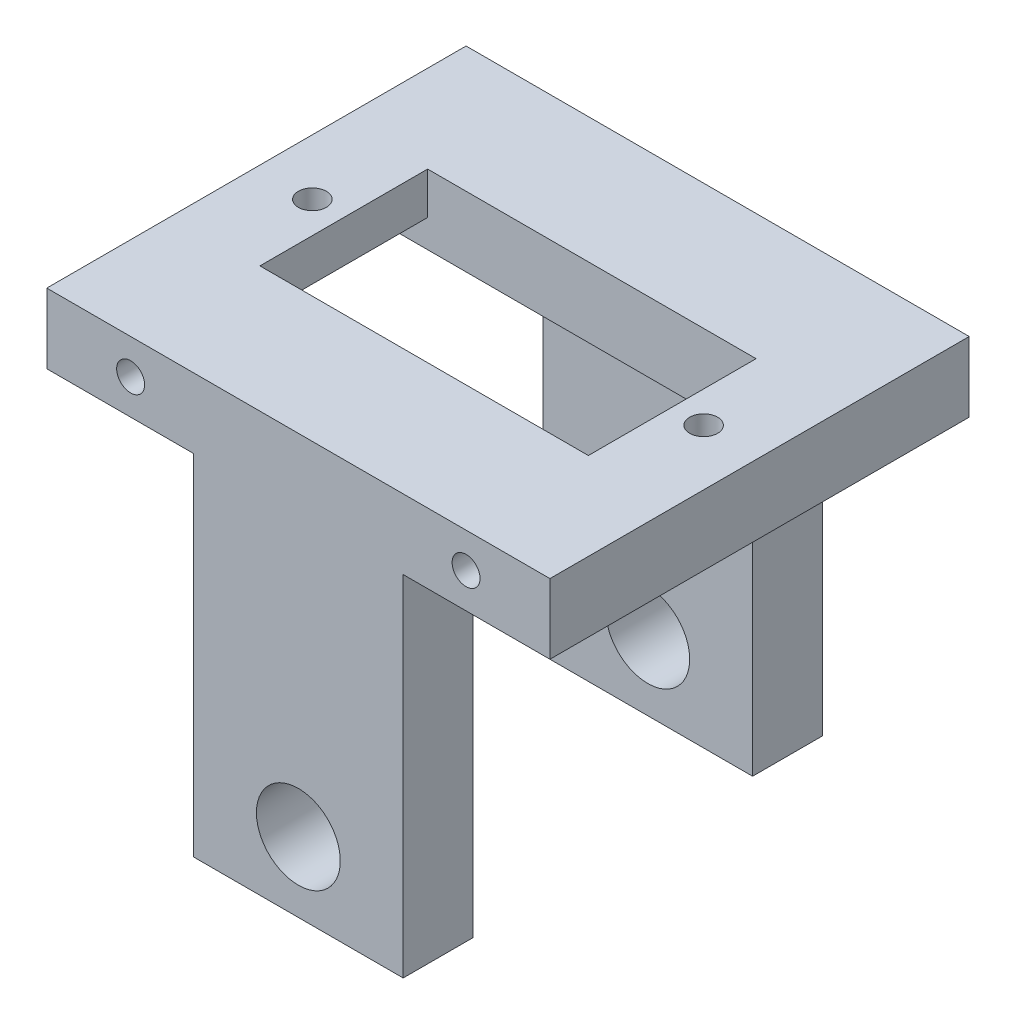
ISO-10303-21;
HEADER;
FILE_DESCRIPTION(('STEP AP214'),'2;1');
FILE_NAME('part.step','',(''),(''),'','','');
FILE_SCHEMA(('AUTOMOTIVE_DESIGN { 1 0 10303 214 1 1 1 1 }'));
ENDSEC;
DATA;
#1=APPLICATION_CONTEXT('core data for automotive mechanical design processes');
#2=APPLICATION_PROTOCOL_DEFINITION('international standard','automotive_design',2000,#1);
#3=PRODUCT_CONTEXT('',#1,'mechanical');
#4=PRODUCT('Part','Part','',(#3));
#5=PRODUCT_RELATED_PRODUCT_CATEGORY('part','',(#4));
#6=PRODUCT_DEFINITION_FORMATION('','',#4);
#7=PRODUCT_DEFINITION_CONTEXT('part definition',#1,'design');
#8=PRODUCT_DEFINITION('design','',#6,#7);
#9=PRODUCT_DEFINITION_SHAPE('','',#8);
#10=(LENGTH_UNIT() NAMED_UNIT(*) SI_UNIT(.MILLI.,.METRE.));
#11=(NAMED_UNIT(*) PLANE_ANGLE_UNIT() SI_UNIT($,.RADIAN.));
#12=(NAMED_UNIT(*) SI_UNIT($,.STERADIAN.) SOLID_ANGLE_UNIT());
#13=UNCERTAINTY_MEASURE_WITH_UNIT(LENGTH_MEASURE(1.E-05),#10,'distance_accuracy_value','');
#14=(GEOMETRIC_REPRESENTATION_CONTEXT(3) GLOBAL_UNCERTAINTY_ASSIGNED_CONTEXT((#13)) GLOBAL_UNIT_ASSIGNED_CONTEXT((#10,
#11,#12)) REPRESENTATION_CONTEXT('',''));
#15=CARTESIAN_POINT('',(0.,0.,0.));
#16=DIRECTION('',(0.,0.,1.));
#17=DIRECTION('',(1.,0.,0.));
#18=AXIS2_PLACEMENT_3D('',#15,#16,#17);
#19=CARTESIAN_POINT('',(0.,0.,0.));
#20=DIRECTION('',(0.,1.,0.));
#21=DIRECTION('',(0.,0.,1.));
#22=AXIS2_PLACEMENT_3D('',#19,#20,#21);
#23=PLANE('',#22);
#24=DIRECTION('',(-1.,0.,0.));
#25=VECTOR('',#24,1.);
#26=CARTESIAN_POINT('',(-16.5,0.,6.));
#27=LINE('',#26,#25);
#28=CARTESIAN_POINT('',(16.5,0.,6.));
#29=VERTEX_POINT('',#28);
#30=CARTESIAN_POINT('',(-16.5,0.,6.));
#31=VERTEX_POINT('',#30);
#32=EDGE_CURVE('E309',#29,#31,#27,.T.);
#33=ORIENTED_EDGE('',*,*,#32,.F.);
#34=DIRECTION('',(0.,0.,1.));
#35=VECTOR('',#34,1.);
#36=CARTESIAN_POINT('',(16.5,0.,6.));
#37=LINE('',#36,#35);
#38=CARTESIAN_POINT('',(16.5,0.,-6.));
#39=VERTEX_POINT('',#38);
#40=EDGE_CURVE('E289',#39,#29,#37,.T.);
#41=ORIENTED_EDGE('',*,*,#40,.F.);
#42=DIRECTION('',(1.,0.,0.));
#43=VECTOR('',#42,1.);
#44=CARTESIAN_POINT('',(-16.5,0.,-6.));
#45=LINE('',#44,#43);
#46=CARTESIAN_POINT('',(-16.5,0.,-6.));
#47=VERTEX_POINT('',#46);
#48=EDGE_CURVE('E296',#47,#39,#45,.T.);
#49=ORIENTED_EDGE('',*,*,#48,.F.);
#50=DIRECTION('',(0.,0.,-1.));
#51=VECTOR('',#50,1.);
#52=CARTESIAN_POINT('',(-16.5,0.,6.));
#53=LINE('',#52,#51);
#54=EDGE_CURVE('E311',#31,#47,#53,.T.);
#55=ORIENTED_EDGE('',*,*,#54,.F.);
#56=EDGE_LOOP('',(#33,#41,#49,#55));
#57=FACE_BOUND('',#56,.T.);
#58=DIRECTION('',(0.,0.,-1.));
#59=VECTOR('',#58,1.);
#60=CARTESIAN_POINT('',(-7.50000000000001,0.,-15.));
#61=LINE('',#60,#59);
#62=CARTESIAN_POINT('',(-7.5,0.,-9.99999999999998));
#63=VERTEX_POINT('',#62);
#64=CARTESIAN_POINT('',(-7.50000000000001,0.,-15.));
#65=VERTEX_POINT('',#64);
#66=EDGE_CURVE('E55',#63,#65,#61,.T.);
#67=ORIENTED_EDGE('',*,*,#66,.F.);
#68=DIRECTION('',(-1.,0.,0.));
#69=VECTOR('',#68,1.);
#70=CARTESIAN_POINT('',(-7.5,0.,-9.99999999999998));
#71=LINE('',#70,#69);
#72=CARTESIAN_POINT('',(7.5,0.,-9.99999999999999));
#73=VERTEX_POINT('',#72);
#74=EDGE_CURVE('E179',#73,#63,#71,.T.);
#75=ORIENTED_EDGE('',*,*,#74,.F.);
#76=DIRECTION('',(0.,0.,1.));
#77=VECTOR('',#76,1.);
#78=CARTESIAN_POINT('',(7.49999999999999,0.,-15.));
#79=LINE('',#78,#77);
#80=CARTESIAN_POINT('',(7.49999999999999,0.,-15.));
#81=VERTEX_POINT('',#80);
#82=EDGE_CURVE('E187',#81,#73,#79,.T.);
#83=ORIENTED_EDGE('',*,*,#82,.F.);
#84=DIRECTION('',(-1.,0.,0.));
#85=VECTOR('',#84,1.);
#86=CARTESIAN_POINT('',(-18.,0.,-15.));
#87=LINE('',#86,#85);
#88=CARTESIAN_POINT('',(18.,0.,-15.));
#89=VERTEX_POINT('',#88);
#90=EDGE_CURVE('E339',#89,#81,#87,.T.);
#91=ORIENTED_EDGE('',*,*,#90,.F.);
#92=DIRECTION('',(0.,0.,-1.));
#93=VECTOR('',#92,1.);
#94=CARTESIAN_POINT('',(18.,0.,-15.));
#95=LINE('',#94,#93);
#96=CARTESIAN_POINT('',(18.,0.,15.));
#97=VERTEX_POINT('',#96);
#98=EDGE_CURVE('E318',#97,#89,#95,.T.);
#99=ORIENTED_EDGE('',*,*,#98,.F.);
#100=DIRECTION('',(1.,0.,0.));
#101=VECTOR('',#100,1.);
#102=CARTESIAN_POINT('',(-18.,0.,15.));
#103=LINE('',#102,#101);
#104=CARTESIAN_POINT('',(7.50000000000001,0.,15.));
#105=VERTEX_POINT('',#104);
#106=EDGE_CURVE('E344',#105,#97,#103,.T.);
#107=ORIENTED_EDGE('',*,*,#106,.F.);
#108=DIRECTION('',(0.,0.,1.));
#109=VECTOR('',#108,1.);
#110=CARTESIAN_POINT('',(7.50000000000001,0.,15.));
#111=LINE('',#110,#109);
#112=CARTESIAN_POINT('',(7.50000000000001,0.,9.99999999999999));
#113=VERTEX_POINT('',#112);
#114=EDGE_CURVE('E63',#113,#105,#111,.T.);
#115=ORIENTED_EDGE('',*,*,#114,.F.);
#116=DIRECTION('',(1.,0.,0.));
#117=VECTOR('',#116,1.);
#118=CARTESIAN_POINT('',(-7.49999999999999,0.,9.99999999999999));
#119=LINE('',#118,#117);
#120=CARTESIAN_POINT('',(-7.49999999999999,0.,9.99999999999999));
#121=VERTEX_POINT('',#120);
#122=EDGE_CURVE('E212',#121,#113,#119,.T.);
#123=ORIENTED_EDGE('',*,*,#122,.F.);
#124=DIRECTION('',(0.,0.,-1.));
#125=VECTOR('',#124,1.);
#126=CARTESIAN_POINT('',(-7.49999999999999,0.,15.));
#127=LINE('',#126,#125);
#128=CARTESIAN_POINT('',(-7.49999999999999,0.,15.));
#129=VERTEX_POINT('',#128);
#130=EDGE_CURVE('E198',#129,#121,#127,.T.);
#131=ORIENTED_EDGE('',*,*,#130,.F.);
#132=CARTESIAN_POINT('',(-18.,0.,15.));
#133=VERTEX_POINT('',#132);
#134=EDGE_CURVE('E330',#133,#129,#103,.T.);
#135=ORIENTED_EDGE('',*,*,#134,.F.);
#136=DIRECTION('',(0.,0.,1.));
#137=VECTOR('',#136,1.);
#138=CARTESIAN_POINT('',(-18.,0.,-15.));
#139=LINE('',#138,#137);
#140=CARTESIAN_POINT('',(-18.,0.,-15.));
#141=VERTEX_POINT('',#140);
#142=EDGE_CURVE('E342',#141,#133,#139,.T.);
#143=ORIENTED_EDGE('',*,*,#142,.F.);
#144=EDGE_CURVE('E196',#65,#141,#87,.T.);
#145=ORIENTED_EDGE('',*,*,#144,.F.);
#146=EDGE_LOOP('',(#67,#75,#83,#91,#99,#107,#115,#123,#131,#135,#143,#145));
#147=FACE_BOUND('',#146,.T.);
#148=ADVANCED_FACE('F39',(#57,#147),#23,.F.);
#149=CARTESIAN_POINT('',(0.,2.,0.));
#150=DIRECTION('',(0.,-1.,0.));
#151=DIRECTION('',(0.,0.,-1.));
#152=AXIS2_PLACEMENT_3D('',#149,#150,#151);
#153=PLANE('',#152);
#154=DIRECTION('',(0.,0.,-1.));
#155=VECTOR('',#154,1.);
#156=CARTESIAN_POINT('',(-11.75,2.,0.));
#157=LINE('',#156,#155);
#158=CARTESIAN_POINT('',(-11.75,2.,6.));
#159=VERTEX_POINT('',#158);
#160=CARTESIAN_POINT('',(-11.75,2.,-6.));
#161=VERTEX_POINT('',#160);
#162=EDGE_CURVE('E11',#159,#161,#157,.T.);
#163=ORIENTED_EDGE('',*,*,#162,.F.);
#164=DIRECTION('',(-1.,0.,0.));
#165=VECTOR('',#164,1.);
#166=CARTESIAN_POINT('',(-16.5,2.,6.));
#167=LINE('',#166,#165);
#168=CARTESIAN_POINT('',(-16.5,2.,6.));
#169=VERTEX_POINT('',#168);
#170=EDGE_CURVE('E295',#159,#169,#167,.T.);
#171=ORIENTED_EDGE('',*,*,#170,.T.);
#172=DIRECTION('',(0.,0.,-1.));
#173=VECTOR('',#172,1.);
#174=CARTESIAN_POINT('',(-16.5,2.,6.));
#175=LINE('',#174,#173);
#176=CARTESIAN_POINT('',(-16.5,2.,-6.));
#177=VERTEX_POINT('',#176);
#178=EDGE_CURVE('E300',#169,#177,#175,.T.);
#179=ORIENTED_EDGE('',*,*,#178,.T.);
#180=DIRECTION('',(1.,0.,0.));
#181=VECTOR('',#180,1.);
#182=CARTESIAN_POINT('',(-16.5,2.,-6.));
#183=LINE('',#182,#181);
#184=EDGE_CURVE('E304',#177,#161,#183,.T.);
#185=ORIENTED_EDGE('',*,*,#184,.T.);
#186=EDGE_LOOP('',(#163,#171,#179,#185));
#187=FACE_BOUND('',#186,.T.);
#188=CARTESIAN_POINT('',(-14.,2.,0.));
#189=DIRECTION('',(0.,-1.,0.));
#190=DIRECTION('',(0.,0.,-1.));
#191=AXIS2_PLACEMENT_3D('',#188,#189,#190);
#192=CIRCLE('',#191,1.);
#193=CARTESIAN_POINT('',(-14.,2.,-1.));
#194=VERTEX_POINT('',#193);
#195=EDGE_CURVE('E279',#194,#194,#192,.T.);
#196=ORIENTED_EDGE('',*,*,#195,.F.);
#197=EDGE_LOOP('',(#196));
#198=FACE_BOUND('',#197,.T.);
#199=ADVANCED_FACE('F387',(#187,#198),#153,.T.);
#200=CARTESIAN_POINT('',(18.,5.,-15.));
#201=DIRECTION('',(-1.,0.,0.));
#202=DIRECTION('',(0.,0.,1.));
#203=AXIS2_PLACEMENT_3D('',#200,#201,#202);
#204=PLANE('',#203);
#205=ORIENTED_EDGE('',*,*,#98,.T.);
#206=DIRECTION('',(0.,-1.,0.));
#207=VECTOR('',#206,1.);
#208=CARTESIAN_POINT('',(18.,5.,-15.));
#209=LINE('',#208,#207);
#210=CARTESIAN_POINT('',(18.,5.,-15.));
#211=VERTEX_POINT('',#210);
#212=EDGE_CURVE('E355',#211,#89,#209,.T.);
#213=ORIENTED_EDGE('',*,*,#212,.F.);
#214=DIRECTION('',(0.,0.,-1.));
#215=VECTOR('',#214,1.);
#216=CARTESIAN_POINT('',(18.,5.,-15.));
#217=LINE('',#216,#215);
#218=CARTESIAN_POINT('',(18.,5.,15.));
#219=VERTEX_POINT('',#218);
#220=EDGE_CURVE('E326',#219,#211,#217,.T.);
#221=ORIENTED_EDGE('',*,*,#220,.F.);
#222=DIRECTION('',(0.,-1.,0.));
#223=VECTOR('',#222,1.);
#224=CARTESIAN_POINT('',(18.,5.,15.));
#225=LINE('',#224,#223);
#226=EDGE_CURVE('E336',#219,#97,#225,.T.);
#227=ORIENTED_EDGE('',*,*,#226,.T.);
#228=EDGE_LOOP('',(#205,#213,#221,#227));
#229=FACE_BOUND('',#228,.T.);
#230=ADVANCED_FACE('F41',(#229),#204,.F.);
#231=CARTESIAN_POINT('',(-18.,5.,-15.));
#232=DIRECTION('',(0.,0.,1.));
#233=DIRECTION('',(1.,0.,0.));
#234=AXIS2_PLACEMENT_3D('',#231,#232,#233);
#235=PLANE('',#234);
#236=CARTESIAN_POINT('',(0.,-20.,-15.));
#237=DIRECTION('',(0.,0.,-1.));
#238=DIRECTION('',(-1.,0.,0.));
#239=AXIS2_PLACEMENT_3D('',#236,#237,#238);
#240=CIRCLE('',#239,3.);
#241=CARTESIAN_POINT('',(-3.,-20.,-15.));
#242=VERTEX_POINT('',#241);
#243=EDGE_CURVE('E436',#242,#242,#240,.T.);
#244=ORIENTED_EDGE('',*,*,#243,.F.);
#245=EDGE_LOOP('',(#244));
#246=FACE_BOUND('',#245,.T.);
#247=CARTESIAN_POINT('',(12.,2.5,-15.));
#248=DIRECTION('',(0.,0.,-1.));
#249=DIRECTION('',(1.,0.,0.));
#250=AXIS2_PLACEMENT_3D('',#247,#248,#249);
#251=CIRCLE('',#250,1.);
#252=CARTESIAN_POINT('',(13.,2.5,-15.));
#253=VERTEX_POINT('',#252);
#254=EDGE_CURVE('E243',#253,#253,#251,.T.);
#255=ORIENTED_EDGE('',*,*,#254,.F.);
#256=EDGE_LOOP('',(#255));
#257=FACE_BOUND('',#256,.T.);
#258=CARTESIAN_POINT('',(-12.,2.5,-15.));
#259=DIRECTION('',(0.,0.,-1.));
#260=DIRECTION('',(-1.,0.,0.));
#261=AXIS2_PLACEMENT_3D('',#258,#259,#260);
#262=CIRCLE('',#261,1.);
#263=CARTESIAN_POINT('',(-13.,2.5,-15.));
#264=VERTEX_POINT('',#263);
#265=EDGE_CURVE('E249',#264,#264,#262,.T.);
#266=ORIENTED_EDGE('',*,*,#265,.F.);
#267=EDGE_LOOP('',(#266));
#268=FACE_BOUND('',#267,.T.);
#269=ORIENTED_EDGE('',*,*,#90,.T.);
#270=DIRECTION('',(0.,1.,0.));
#271=VECTOR('',#270,1.);
#272=CARTESIAN_POINT('',(7.49999999999999,-25.,-15.));
#273=LINE('',#272,#271);
#274=CARTESIAN_POINT('',(7.49999999999999,-25.,-15.));
#275=VERTEX_POINT('',#274);
#276=EDGE_CURVE('E424',#275,#81,#273,.T.);
#277=ORIENTED_EDGE('',*,*,#276,.F.);
#278=DIRECTION('',(1.,0.,0.));
#279=VECTOR('',#278,1.);
#280=CARTESIAN_POINT('',(-7.50000000000001,-25.,-15.));
#281=LINE('',#280,#279);
#282=CARTESIAN_POINT('',(-7.50000000000001,-25.,-15.));
#283=VERTEX_POINT('',#282);
#284=EDGE_CURVE('E205',#283,#275,#281,.T.);
#285=ORIENTED_EDGE('',*,*,#284,.F.);
#286=DIRECTION('',(0.,1.,0.));
#287=VECTOR('',#286,1.);
#288=CARTESIAN_POINT('',(-7.50000000000001,-25.,-15.));
#289=LINE('',#288,#287);
#290=EDGE_CURVE('E425',#283,#65,#289,.T.);
#291=ORIENTED_EDGE('',*,*,#290,.T.);
#292=ORIENTED_EDGE('',*,*,#144,.T.);
#293=DIRECTION('',(0.,-1.,0.));
#294=VECTOR('',#293,1.);
#295=CARTESIAN_POINT('',(-18.,5.,-15.));
#296=LINE('',#295,#294);
#297=CARTESIAN_POINT('',(-18.,5.,-15.));
#298=VERTEX_POINT('',#297);
#299=EDGE_CURVE('E352',#298,#141,#296,.T.);
#300=ORIENTED_EDGE('',*,*,#299,.F.);
#301=DIRECTION('',(-1.,0.,0.));
#302=VECTOR('',#301,1.);
#303=CARTESIAN_POINT('',(-18.,5.,-15.));
#304=LINE('',#303,#302);
#305=EDGE_CURVE('E329',#211,#298,#304,.T.);
#306=ORIENTED_EDGE('',*,*,#305,.F.);
#307=ORIENTED_EDGE('',*,*,#212,.T.);
#308=EDGE_LOOP('',(#269,#277,#285,#291,#292,#300,#306,#307));
#309=FACE_BOUND('',#308,.T.);
#310=ADVANCED_FACE('F413',(#246,#257,#268,#309),#235,.F.);
#311=CARTESIAN_POINT('',(-18.,5.,-15.));
#312=DIRECTION('',(1.,0.,0.));
#313=DIRECTION('',(0.,0.,-1.));
#314=AXIS2_PLACEMENT_3D('',#311,#312,#313);
#315=PLANE('',#314);
#316=ORIENTED_EDGE('',*,*,#142,.T.);
#317=DIRECTION('',(0.,-1.,0.));
#318=VECTOR('',#317,1.);
#319=CARTESIAN_POINT('',(-18.,5.,15.));
#320=LINE('',#319,#318);
#321=CARTESIAN_POINT('',(-18.,5.,15.));
#322=VERTEX_POINT('',#321);
#323=EDGE_CURVE('E349',#322,#133,#320,.T.);
#324=ORIENTED_EDGE('',*,*,#323,.F.);
#325=DIRECTION('',(0.,0.,1.));
#326=VECTOR('',#325,1.);
#327=CARTESIAN_POINT('',(-18.,5.,-15.));
#328=LINE('',#327,#326);
#329=EDGE_CURVE('E332',#298,#322,#328,.T.);
#330=ORIENTED_EDGE('',*,*,#329,.F.);
#331=ORIENTED_EDGE('',*,*,#299,.T.);
#332=EDGE_LOOP('',(#316,#324,#330,#331));
#333=FACE_BOUND('',#332,.T.);
#334=ADVANCED_FACE('F418',(#333),#315,.F.);
#335=CARTESIAN_POINT('',(-18.,5.,15.));
#336=DIRECTION('',(0.,0.,-1.));
#337=DIRECTION('',(-1.,0.,0.));
#338=AXIS2_PLACEMENT_3D('',#335,#336,#337);
#339=PLANE('',#338);
#340=CARTESIAN_POINT('',(0.,-20.,15.));
#341=DIRECTION('',(0.,0.,-1.));
#342=DIRECTION('',(-1.,0.,0.));
#343=AXIS2_PLACEMENT_3D('',#340,#341,#342);
#344=CIRCLE('',#343,3.);
#345=CARTESIAN_POINT('',(-3.,-20.,15.));
#346=VERTEX_POINT('',#345);
#347=EDGE_CURVE('E433',#346,#346,#344,.F.);
#348=ORIENTED_EDGE('',*,*,#347,.F.);
#349=EDGE_LOOP('',(#348));
#350=FACE_BOUND('',#349,.T.);
#351=CARTESIAN_POINT('',(12.,2.5,15.));
#352=DIRECTION('',(0.,0.,-1.));
#353=DIRECTION('',(1.,0.,0.));
#354=AXIS2_PLACEMENT_3D('',#351,#352,#353);
#355=CIRCLE('',#354,1.);
#356=CARTESIAN_POINT('',(13.,2.5,15.));
#357=VERTEX_POINT('',#356);
#358=EDGE_CURVE('E233',#357,#357,#355,.T.);
#359=ORIENTED_EDGE('',*,*,#358,.T.);
#360=EDGE_LOOP('',(#359));
#361=FACE_BOUND('',#360,.T.);
#362=CARTESIAN_POINT('',(-12.,2.5,15.));
#363=DIRECTION('',(0.,0.,-1.));
#364=DIRECTION('',(-1.,0.,0.));
#365=AXIS2_PLACEMENT_3D('',#362,#363,#364);
#366=CIRCLE('',#365,1.);
#367=CARTESIAN_POINT('',(-13.,2.5,15.));
#368=VERTEX_POINT('',#367);
#369=EDGE_CURVE('E237',#368,#368,#366,.T.);
#370=ORIENTED_EDGE('',*,*,#369,.T.);
#371=EDGE_LOOP('',(#370));
#372=FACE_BOUND('',#371,.T.);
#373=ORIENTED_EDGE('',*,*,#134,.T.);
#374=DIRECTION('',(0.,1.,0.));
#375=VECTOR('',#374,1.);
#376=CARTESIAN_POINT('',(-7.49999999999999,-25.,15.));
#377=LINE('',#376,#375);
#378=CARTESIAN_POINT('',(-7.49999999999999,-25.,15.));
#379=VERTEX_POINT('',#378);
#380=EDGE_CURVE('E227',#379,#129,#377,.T.);
#381=ORIENTED_EDGE('',*,*,#380,.F.);
#382=DIRECTION('',(-1.,0.,0.));
#383=VECTOR('',#382,1.);
#384=CARTESIAN_POINT('',(-7.49999999999999,-25.,15.));
#385=LINE('',#384,#383);
#386=CARTESIAN_POINT('',(7.50000000000001,-25.,15.));
#387=VERTEX_POINT('',#386);
#388=EDGE_CURVE('E211',#387,#379,#385,.T.);
#389=ORIENTED_EDGE('',*,*,#388,.F.);
#390=DIRECTION('',(0.,1.,0.));
#391=VECTOR('',#390,1.);
#392=CARTESIAN_POINT('',(7.50000000000001,-25.,15.));
#393=LINE('',#392,#391);
#394=EDGE_CURVE('E230',#387,#105,#393,.T.);
#395=ORIENTED_EDGE('',*,*,#394,.T.);
#396=ORIENTED_EDGE('',*,*,#106,.T.);
#397=ORIENTED_EDGE('',*,*,#226,.F.);
#398=DIRECTION('',(1.,0.,0.));
#399=VECTOR('',#398,1.);
#400=CARTESIAN_POINT('',(-18.,5.,15.));
#401=LINE('',#400,#399);
#402=EDGE_CURVE('E334',#322,#219,#401,.T.);
#403=ORIENTED_EDGE('',*,*,#402,.F.);
#404=ORIENTED_EDGE('',*,*,#323,.T.);
#405=EDGE_LOOP('',(#373,#381,#389,#395,#396,#397,#403,#404));
#406=FACE_BOUND('',#405,.T.);
#407=ADVANCED_FACE('F399',(#350,#361,#372,#406),#339,.F.);
#408=CARTESIAN_POINT('',(0.,5.,0.));
#409=DIRECTION('',(0.,1.,0.));
#410=DIRECTION('',(0.,0.,1.));
#411=AXIS2_PLACEMENT_3D('',#408,#409,#410);
#412=PLANE('',#411);
#413=DIRECTION('',(-1.,0.,0.));
#414=VECTOR('',#413,1.);
#415=CARTESIAN_POINT('',(-11.75,5.,6.));
#416=LINE('',#415,#414);
#417=CARTESIAN_POINT('',(11.75,5.,6.));
#418=VERTEX_POINT('',#417);
#419=CARTESIAN_POINT('',(-11.75,5.,6.));
#420=VERTEX_POINT('',#419);
#421=EDGE_CURVE('E255',#418,#420,#416,.T.);
#422=ORIENTED_EDGE('',*,*,#421,.T.);
#423=DIRECTION('',(0.,0.,-1.));
#424=VECTOR('',#423,1.);
#425=CARTESIAN_POINT('',(-11.75,5.,-6.));
#426=LINE('',#425,#424);
#427=CARTESIAN_POINT('',(-11.75,5.,-6.));
#428=VERTEX_POINT('',#427);
#429=EDGE_CURVE('E270',#420,#428,#426,.T.);
#430=ORIENTED_EDGE('',*,*,#429,.T.);
#431=DIRECTION('',(1.,0.,0.));
#432=VECTOR('',#431,1.);
#433=CARTESIAN_POINT('',(-11.75,5.,-6.));
#434=LINE('',#433,#432);
#435=CARTESIAN_POINT('',(11.75,5.,-6.));
#436=VERTEX_POINT('',#435);
#437=EDGE_CURVE('E266',#428,#436,#434,.T.);
#438=ORIENTED_EDGE('',*,*,#437,.T.);
#439=DIRECTION('',(0.,0.,1.));
#440=VECTOR('',#439,1.);
#441=CARTESIAN_POINT('',(11.75,5.,-6.));
#442=LINE('',#441,#440);
#443=EDGE_CURVE('E261',#436,#418,#442,.T.);
#444=ORIENTED_EDGE('',*,*,#443,.T.);
#445=EDGE_LOOP('',(#422,#430,#438,#444));
#446=FACE_BOUND('',#445,.T.);
#447=CARTESIAN_POINT('',(-14.,5.,0.));
#448=DIRECTION('',(0.,-1.,0.));
#449=DIRECTION('',(0.,0.,-1.));
#450=AXIS2_PLACEMENT_3D('',#447,#448,#449);
#451=CIRCLE('',#450,1.);
#452=CARTESIAN_POINT('',(-14.,5.,-1.));
#453=VERTEX_POINT('',#452);
#454=EDGE_CURVE('E280',#453,#453,#451,.T.);
#455=ORIENTED_EDGE('',*,*,#454,.T.);
#456=EDGE_LOOP('',(#455));
#457=FACE_BOUND('',#456,.T.);
#458=CARTESIAN_POINT('',(14.,5.,0.));
#459=DIRECTION('',(0.,-1.,0.));
#460=DIRECTION('',(0.,0.,-1.));
#461=AXIS2_PLACEMENT_3D('',#458,#459,#460);
#462=CIRCLE('',#461,1.);
#463=CARTESIAN_POINT('',(14.,5.,-1.));
#464=VERTEX_POINT('',#463);
#465=EDGE_CURVE('E286',#464,#464,#462,.T.);
#466=ORIENTED_EDGE('',*,*,#465,.T.);
#467=EDGE_LOOP('',(#466));
#468=FACE_BOUND('',#467,.T.);
#469=ORIENTED_EDGE('',*,*,#220,.T.);
#470=ORIENTED_EDGE('',*,*,#305,.T.);
#471=ORIENTED_EDGE('',*,*,#329,.T.);
#472=ORIENTED_EDGE('',*,*,#402,.T.);
#473=EDGE_LOOP('',(#469,#470,#471,#472));
#474=FACE_BOUND('',#473,.T.);
#475=ADVANCED_FACE('F396',(#446,#457,#468,#474),#412,.T.);
#476=CARTESIAN_POINT('',(16.5,2.,6.));
#477=DIRECTION('',(1.,0.,0.));
#478=DIRECTION('',(0.,0.,-1.));
#479=AXIS2_PLACEMENT_3D('',#476,#477,#478);
#480=PLANE('',#479);
#481=ORIENTED_EDGE('',*,*,#40,.T.);
#482=DIRECTION('',(0.,-1.,0.));
#483=VECTOR('',#482,1.);
#484=CARTESIAN_POINT('',(16.5,2.,6.));
#485=LINE('',#484,#483);
#486=CARTESIAN_POINT('',(16.5,2.,6.));
#487=VERTEX_POINT('',#486);
#488=EDGE_CURVE('E307',#487,#29,#485,.T.);
#489=ORIENTED_EDGE('',*,*,#488,.F.);
#490=DIRECTION('',(0.,0.,1.));
#491=VECTOR('',#490,1.);
#492=CARTESIAN_POINT('',(16.5,2.,6.));
#493=LINE('',#492,#491);
#494=CARTESIAN_POINT('',(16.5,2.,-6.));
#495=VERTEX_POINT('',#494);
#496=EDGE_CURVE('E292',#495,#487,#493,.T.);
#497=ORIENTED_EDGE('',*,*,#496,.F.);
#498=DIRECTION('',(0.,-1.,0.));
#499=VECTOR('',#498,1.);
#500=CARTESIAN_POINT('',(16.5,2.,-6.));
#501=LINE('',#500,#499);
#502=EDGE_CURVE('E315',#495,#39,#501,.T.);
#503=ORIENTED_EDGE('',*,*,#502,.T.);
#504=EDGE_LOOP('',(#481,#489,#497,#503));
#505=FACE_BOUND('',#504,.T.);
#506=ADVANCED_FACE('F374',(#505),#480,.F.);
#507=CARTESIAN_POINT('',(-16.5,2.,-6.));
#508=DIRECTION('',(0.,0.,-1.));
#509=DIRECTION('',(-1.,0.,0.));
#510=AXIS2_PLACEMENT_3D('',#507,#508,#509);
#511=PLANE('',#510);
#512=CARTESIAN_POINT('',(11.75,2.,-6.));
#513=VERTEX_POINT('',#512);
#514=EDGE_CURVE('E303',#513,#495,#183,.T.);
#515=ORIENTED_EDGE('',*,*,#514,.F.);
#516=DIRECTION('',(0.,-1.,0.));
#517=VECTOR('',#516,1.);
#518=CARTESIAN_POINT('',(11.75,31.3865496039175,-6.));
#519=LINE('',#518,#517);
#520=EDGE_CURVE('E265',#436,#513,#519,.T.);
#521=ORIENTED_EDGE('',*,*,#520,.F.);
#522=ORIENTED_EDGE('',*,*,#437,.F.);
#523=DIRECTION('',(0.,-1.,0.));
#524=VECTOR('',#523,1.);
#525=CARTESIAN_POINT('',(-11.75,31.3865496039175,-6.));
#526=LINE('',#525,#524);
#527=EDGE_CURVE('E269',#428,#161,#526,.T.);
#528=ORIENTED_EDGE('',*,*,#527,.T.);
#529=ORIENTED_EDGE('',*,*,#184,.F.);
#530=DIRECTION('',(0.,-1.,0.));
#531=VECTOR('',#530,1.);
#532=CARTESIAN_POINT('',(-16.5,2.,-6.));
#533=LINE('',#532,#531);
#534=EDGE_CURVE('E319',#177,#47,#533,.T.);
#535=ORIENTED_EDGE('',*,*,#534,.T.);
#536=ORIENTED_EDGE('',*,*,#48,.T.);
#537=ORIENTED_EDGE('',*,*,#502,.F.);
#538=EDGE_LOOP('',(#515,#521,#522,#528,#529,#535,#536,#537));
#539=FACE_BOUND('',#538,.T.);
#540=ADVANCED_FACE('F394',(#539),#511,.F.);
#541=CARTESIAN_POINT('',(-16.5,2.,6.));
#542=DIRECTION('',(-1.,0.,0.));
#543=DIRECTION('',(0.,0.,1.));
#544=AXIS2_PLACEMENT_3D('',#541,#542,#543);
#545=PLANE('',#544);
#546=ORIENTED_EDGE('',*,*,#54,.T.);
#547=ORIENTED_EDGE('',*,*,#534,.F.);
#548=ORIENTED_EDGE('',*,*,#178,.F.);
#549=DIRECTION('',(0.,-1.,0.));
#550=VECTOR('',#549,1.);
#551=CARTESIAN_POINT('',(-16.5,2.,6.));
#552=LINE('',#551,#550);
#553=EDGE_CURVE('E321',#169,#31,#552,.T.);
#554=ORIENTED_EDGE('',*,*,#553,.T.);
#555=EDGE_LOOP('',(#546,#547,#548,#554));
#556=FACE_BOUND('',#555,.T.);
#557=ADVANCED_FACE('F382',(#556),#545,.F.);
#558=CARTESIAN_POINT('',(-16.5,2.,6.));
#559=DIRECTION('',(0.,0.,1.));
#560=DIRECTION('',(1.,0.,0.));
#561=AXIS2_PLACEMENT_3D('',#558,#559,#560);
#562=PLANE('',#561);
#563=ORIENTED_EDGE('',*,*,#32,.T.);
#564=ORIENTED_EDGE('',*,*,#553,.F.);
#565=ORIENTED_EDGE('',*,*,#170,.F.);
#566=DIRECTION('',(0.,-1.,0.));
#567=VECTOR('',#566,1.);
#568=CARTESIAN_POINT('',(-11.75,31.3865496039175,6.));
#569=LINE('',#568,#567);
#570=EDGE_CURVE('E260',#420,#159,#569,.T.);
#571=ORIENTED_EDGE('',*,*,#570,.F.);
#572=ORIENTED_EDGE('',*,*,#421,.F.);
#573=DIRECTION('',(0.,-1.,0.));
#574=VECTOR('',#573,1.);
#575=CARTESIAN_POINT('',(11.75,31.3865496039175,6.));
#576=LINE('',#575,#574);
#577=CARTESIAN_POINT('',(11.75,2.,6.));
#578=VERTEX_POINT('',#577);
#579=EDGE_CURVE('E264',#418,#578,#576,.T.);
#580=ORIENTED_EDGE('',*,*,#579,.T.);
#581=EDGE_CURVE('E297',#487,#578,#167,.T.);
#582=ORIENTED_EDGE('',*,*,#581,.F.);
#583=ORIENTED_EDGE('',*,*,#488,.T.);
#584=EDGE_LOOP('',(#563,#564,#565,#571,#572,#580,#582,#583));
#585=FACE_BOUND('',#584,.T.);
#586=ADVANCED_FACE('F367',(#585),#562,.F.);
#587=DIRECTION('',(0.,0.,1.));
#588=VECTOR('',#587,1.);
#589=CARTESIAN_POINT('',(11.75,2.,0.));
#590=LINE('',#589,#588);
#591=EDGE_CURVE('E48',#513,#578,#590,.T.);
#592=ORIENTED_EDGE('',*,*,#591,.F.);
#593=ORIENTED_EDGE('',*,*,#514,.T.);
#594=ORIENTED_EDGE('',*,*,#496,.T.);
#595=ORIENTED_EDGE('',*,*,#581,.T.);
#596=EDGE_LOOP('',(#592,#593,#594,#595));
#597=FACE_BOUND('',#596,.T.);
#598=CARTESIAN_POINT('',(14.,2.,0.));
#599=DIRECTION('',(0.,-1.,0.));
#600=DIRECTION('',(0.,0.,-1.));
#601=AXIS2_PLACEMENT_3D('',#598,#599,#600);
#602=CIRCLE('',#601,1.);
#603=CARTESIAN_POINT('',(14.,2.,-1.));
#604=VERTEX_POINT('',#603);
#605=EDGE_CURVE('E283',#604,#604,#602,.T.);
#606=ORIENTED_EDGE('',*,*,#605,.F.);
#607=EDGE_LOOP('',(#606));
#608=FACE_BOUND('',#607,.T.);
#609=ADVANCED_FACE('F369',(#597,#608),#153,.T.);
#610=CARTESIAN_POINT('',(14.,5.,0.));
#611=DIRECTION('',(0.,-1.,0.));
#612=DIRECTION('',(0.,0.,-1.));
#613=AXIS2_PLACEMENT_3D('',#610,#611,#612);
#614=CYLINDRICAL_SURFACE('',#613,1.);
#615=ORIENTED_EDGE('',*,*,#465,.F.);
#616=EDGE_LOOP('',(#615));
#617=FACE_BOUND('',#616,.T.);
#618=ORIENTED_EDGE('',*,*,#605,.T.);
#619=EDGE_LOOP('',(#618));
#620=FACE_BOUND('',#619,.T.);
#621=ADVANCED_FACE('F521',(#617,#620),#614,.F.);
#622=CARTESIAN_POINT('',(-14.,5.,0.));
#623=DIRECTION('',(0.,-1.,0.));
#624=DIRECTION('',(0.,0.,-1.));
#625=AXIS2_PLACEMENT_3D('',#622,#623,#624);
#626=CYLINDRICAL_SURFACE('',#625,1.);
#627=ORIENTED_EDGE('',*,*,#454,.F.);
#628=EDGE_LOOP('',(#627));
#629=FACE_BOUND('',#628,.T.);
#630=ORIENTED_EDGE('',*,*,#195,.T.);
#631=EDGE_LOOP('',(#630));
#632=FACE_BOUND('',#631,.T.);
#633=ADVANCED_FACE('F527',(#629,#632),#626,.F.);
#634=CARTESIAN_POINT('',(-11.75,31.3865496039175,-6.));
#635=DIRECTION('',(-1.,0.,0.));
#636=DIRECTION('',(0.,0.,1.));
#637=AXIS2_PLACEMENT_3D('',#634,#635,#636);
#638=PLANE('',#637);
#639=ORIENTED_EDGE('',*,*,#162,.T.);
#640=ORIENTED_EDGE('',*,*,#527,.F.);
#641=ORIENTED_EDGE('',*,*,#429,.F.);
#642=ORIENTED_EDGE('',*,*,#570,.T.);
#643=EDGE_LOOP('',(#639,#640,#641,#642));
#644=FACE_BOUND('',#643,.T.);
#645=ADVANCED_FACE('F392',(#644),#638,.F.);
#646=CARTESIAN_POINT('',(11.75,31.3865496039175,-6.));
#647=DIRECTION('',(1.,0.,0.));
#648=DIRECTION('',(0.,0.,-1.));
#649=AXIS2_PLACEMENT_3D('',#646,#647,#648);
#650=PLANE('',#649);
#651=ORIENTED_EDGE('',*,*,#591,.T.);
#652=ORIENTED_EDGE('',*,*,#579,.F.);
#653=ORIENTED_EDGE('',*,*,#443,.F.);
#654=ORIENTED_EDGE('',*,*,#520,.T.);
#655=EDGE_LOOP('',(#651,#652,#653,#654));
#656=FACE_BOUND('',#655,.T.);
#657=ADVANCED_FACE('F360',(#656),#650,.F.);
#658=CARTESIAN_POINT('',(-12.,2.5,-10.));
#659=DIRECTION('',(0.,0.,-1.));
#660=DIRECTION('',(-1.,0.,0.));
#661=AXIS2_PLACEMENT_3D('',#658,#659,#660);
#662=CYLINDRICAL_SURFACE('',#661,1.);
#663=CARTESIAN_POINT('',(-12.,2.5,-10.));
#664=DIRECTION('',(0.,0.,-1.));
#665=DIRECTION('',(-1.,0.,0.));
#666=AXIS2_PLACEMENT_3D('',#663,#664,#665);
#667=CIRCLE('',#666,1.);
#668=CARTESIAN_POINT('',(-13.,2.5,-10.));
#669=VERTEX_POINT('',#668);
#670=EDGE_CURVE('E252',#669,#669,#667,.T.);
#671=ORIENTED_EDGE('',*,*,#670,.F.);
#672=EDGE_LOOP('',(#671));
#673=FACE_BOUND('',#672,.T.);
#674=ORIENTED_EDGE('',*,*,#265,.T.);
#675=EDGE_LOOP('',(#674));
#676=FACE_BOUND('',#675,.T.);
#677=ADVANCED_FACE('F449',(#673,#676),#662,.F.);
#678=CARTESIAN_POINT('',(-12.,2.5,-10.));
#679=DIRECTION('',(0.,0.,-1.));
#680=DIRECTION('',(-1.,0.,0.));
#681=AXIS2_PLACEMENT_3D('',#678,#679,#680);
#682=PLANE('',#681);
#683=ORIENTED_EDGE('',*,*,#670,.T.);
#684=EDGE_LOOP('',(#683));
#685=FACE_BOUND('',#684,.T.);
#686=ADVANCED_FACE('F451',(#685),#682,.T.);
#687=CARTESIAN_POINT('',(12.,2.5,-10.));
#688=DIRECTION('',(0.,0.,-1.));
#689=DIRECTION('',(-1.,0.,0.));
#690=AXIS2_PLACEMENT_3D('',#687,#688,#689);
#691=CYLINDRICAL_SURFACE('',#690,1.);
#692=CARTESIAN_POINT('',(12.,2.5,-10.));
#693=DIRECTION('',(0.,0.,-1.));
#694=DIRECTION('',(1.,0.,0.));
#695=AXIS2_PLACEMENT_3D('',#692,#693,#694);
#696=CIRCLE('',#695,1.);
#697=CARTESIAN_POINT('',(13.,2.5,-10.));
#698=VERTEX_POINT('',#697);
#699=EDGE_CURVE('E246',#698,#698,#696,.T.);
#700=ORIENTED_EDGE('',*,*,#699,.F.);
#701=EDGE_LOOP('',(#700));
#702=FACE_BOUND('',#701,.T.);
#703=ORIENTED_EDGE('',*,*,#254,.T.);
#704=EDGE_LOOP('',(#703));
#705=FACE_BOUND('',#704,.T.);
#706=ADVANCED_FACE('F458',(#702,#705),#691,.F.);
#707=CARTESIAN_POINT('',(12.,2.5,-10.));
#708=DIRECTION('',(0.,0.,1.));
#709=DIRECTION('',(1.,0.,0.));
#710=AXIS2_PLACEMENT_3D('',#707,#708,#709);
#711=PLANE('',#710);
#712=ORIENTED_EDGE('',*,*,#699,.T.);
#713=EDGE_LOOP('',(#712));
#714=FACE_BOUND('',#713,.T.);
#715=ADVANCED_FACE('F567',(#714),#711,.F.);
#716=CARTESIAN_POINT('',(-12.,2.5,10.));
#717=DIRECTION('',(0.,0.,1.));
#718=DIRECTION('',(1.,0.,0.));
#719=AXIS2_PLACEMENT_3D('',#716,#717,#718);
#720=CYLINDRICAL_SURFACE('',#719,1.);
#721=CARTESIAN_POINT('',(-12.,2.5,10.));
#722=DIRECTION('',(0.,0.,-1.));
#723=DIRECTION('',(-1.,0.,0.));
#724=AXIS2_PLACEMENT_3D('',#721,#722,#723);
#725=CIRCLE('',#724,1.);
#726=CARTESIAN_POINT('',(-13.,2.5,10.));
#727=VERTEX_POINT('',#726);
#728=EDGE_CURVE('E240',#727,#727,#725,.T.);
#729=ORIENTED_EDGE('',*,*,#728,.T.);
#730=EDGE_LOOP('',(#729));
#731=FACE_BOUND('',#730,.T.);
#732=ORIENTED_EDGE('',*,*,#369,.F.);
#733=EDGE_LOOP('',(#732));
#734=FACE_BOUND('',#733,.T.);
#735=ADVANCED_FACE('F578',(#731,#734),#720,.F.);
#736=CARTESIAN_POINT('',(-12.,2.5,10.));
#737=DIRECTION('',(0.,0.,1.));
#738=DIRECTION('',(-1.,0.,0.));
#739=AXIS2_PLACEMENT_3D('',#736,#737,#738);
#740=PLANE('',#739);
#741=ORIENTED_EDGE('',*,*,#728,.F.);
#742=EDGE_LOOP('',(#741));
#743=FACE_BOUND('',#742,.T.);
#744=ADVANCED_FACE('F589',(#743),#740,.T.);
#745=CARTESIAN_POINT('',(12.,2.5,10.));
#746=DIRECTION('',(0.,0.,1.));
#747=DIRECTION('',(1.,0.,0.));
#748=AXIS2_PLACEMENT_3D('',#745,#746,#747);
#749=CYLINDRICAL_SURFACE('',#748,1.);
#750=CARTESIAN_POINT('',(12.,2.5,10.));
#751=DIRECTION('',(0.,0.,-1.));
#752=DIRECTION('',(1.,0.,0.));
#753=AXIS2_PLACEMENT_3D('',#750,#751,#752);
#754=CIRCLE('',#753,1.);
#755=CARTESIAN_POINT('',(13.,2.5,10.));
#756=VERTEX_POINT('',#755);
#757=EDGE_CURVE('E234',#756,#756,#754,.T.);
#758=ORIENTED_EDGE('',*,*,#757,.T.);
#759=EDGE_LOOP('',(#758));
#760=FACE_BOUND('',#759,.T.);
#761=ORIENTED_EDGE('',*,*,#358,.F.);
#762=EDGE_LOOP('',(#761));
#763=FACE_BOUND('',#762,.T.);
#764=ADVANCED_FACE('F600',(#760,#763),#749,.F.);
#765=CARTESIAN_POINT('',(12.,2.5,10.));
#766=DIRECTION('',(0.,0.,-1.));
#767=DIRECTION('',(1.,0.,0.));
#768=AXIS2_PLACEMENT_3D('',#765,#766,#767);
#769=PLANE('',#768);
#770=ORIENTED_EDGE('',*,*,#757,.F.);
#771=EDGE_LOOP('',(#770));
#772=FACE_BOUND('',#771,.T.);
#773=ADVANCED_FACE('F611',(#772),#769,.F.);
#774=CARTESIAN_POINT('',(7.50000000000001,-25.,15.));
#775=DIRECTION('',(-1.,0.,0.));
#776=DIRECTION('',(0.,0.,1.));
#777=AXIS2_PLACEMENT_3D('',#774,#775,#776);
#778=PLANE('',#777);
#779=ORIENTED_EDGE('',*,*,#114,.T.);
#780=ORIENTED_EDGE('',*,*,#394,.F.);
#781=DIRECTION('',(0.,0.,1.));
#782=VECTOR('',#781,1.);
#783=CARTESIAN_POINT('',(7.50000000000001,-25.,15.));
#784=LINE('',#783,#782);
#785=CARTESIAN_POINT('',(7.50000000000001,-25.,9.99999999999999));
#786=VERTEX_POINT('',#785);
#787=EDGE_CURVE('E208',#786,#387,#784,.T.);
#788=ORIENTED_EDGE('',*,*,#787,.F.);
#789=DIRECTION('',(0.,1.,0.));
#790=VECTOR('',#789,1.);
#791=CARTESIAN_POINT('',(7.50000000000001,-25.,9.99999999999999));
#792=LINE('',#791,#790);
#793=EDGE_CURVE('E217',#786,#113,#792,.T.);
#794=ORIENTED_EDGE('',*,*,#793,.T.);
#795=EDGE_LOOP('',(#779,#780,#788,#794));
#796=FACE_BOUND('',#795,.T.);
#797=ADVANCED_FACE('F621',(#796),#778,.F.);
#798=CARTESIAN_POINT('',(-7.49999999999999,-25.,15.));
#799=DIRECTION('',(1.,0.,0.));
#800=DIRECTION('',(0.,0.,-1.));
#801=AXIS2_PLACEMENT_3D('',#798,#799,#800);
#802=PLANE('',#801);
#803=ORIENTED_EDGE('',*,*,#130,.T.);
#804=DIRECTION('',(0.,1.,0.));
#805=VECTOR('',#804,1.);
#806=CARTESIAN_POINT('',(-7.49999999999999,-25.,9.99999999999999));
#807=LINE('',#806,#805);
#808=CARTESIAN_POINT('',(-7.49999999999999,-25.,9.99999999999999));
#809=VERTEX_POINT('',#808);
#810=EDGE_CURVE('E224',#809,#121,#807,.T.);
#811=ORIENTED_EDGE('',*,*,#810,.F.);
#812=DIRECTION('',(0.,0.,-1.));
#813=VECTOR('',#812,1.);
#814=CARTESIAN_POINT('',(-7.49999999999999,-25.,15.));
#815=LINE('',#814,#813);
#816=EDGE_CURVE('E214',#379,#809,#815,.T.);
#817=ORIENTED_EDGE('',*,*,#816,.F.);
#818=ORIENTED_EDGE('',*,*,#380,.T.);
#819=EDGE_LOOP('',(#803,#811,#817,#818));
#820=FACE_BOUND('',#819,.T.);
#821=ADVANCED_FACE('F639',(#820),#802,.F.);
#822=CARTESIAN_POINT('',(-7.49999999999999,-25.,9.99999999999999));
#823=DIRECTION('',(0.,0.,1.));
#824=DIRECTION('',(1.,0.,0.));
#825=AXIS2_PLACEMENT_3D('',#822,#823,#824);
#826=PLANE('',#825);
#827=CARTESIAN_POINT('',(0.,-20.,9.99999999999999));
#828=DIRECTION('',(0.,0.,1.));
#829=DIRECTION('',(1.,0.,0.));
#830=AXIS2_PLACEMENT_3D('',#827,#828,#829);
#831=CIRCLE('',#830,3.);
#832=CARTESIAN_POINT('',(3.,-20.,9.99999999999999));
#833=VERTEX_POINT('',#832);
#834=EDGE_CURVE('E428',#833,#833,#831,.T.);
#835=ORIENTED_EDGE('',*,*,#834,.T.);
#836=EDGE_LOOP('',(#835));
#837=FACE_BOUND('',#836,.T.);
#838=ORIENTED_EDGE('',*,*,#122,.T.);
#839=ORIENTED_EDGE('',*,*,#793,.F.);
#840=DIRECTION('',(1.,0.,0.));
#841=VECTOR('',#840,1.);
#842=CARTESIAN_POINT('',(-7.49999999999999,-25.,9.99999999999999));
#843=LINE('',#842,#841);
#844=EDGE_CURVE('E216',#809,#786,#843,.T.);
#845=ORIENTED_EDGE('',*,*,#844,.F.);
#846=ORIENTED_EDGE('',*,*,#810,.T.);
#847=EDGE_LOOP('',(#838,#839,#845,#846));
#848=FACE_BOUND('',#847,.T.);
#849=ADVANCED_FACE('F650',(#837,#848),#826,.F.);
#850=CARTESIAN_POINT('',(0.,-25.,0.));
#851=DIRECTION('',(0.,-1.,0.));
#852=DIRECTION('',(0.,0.,-1.));
#853=AXIS2_PLACEMENT_3D('',#850,#851,#852);
#854=PLANE('',#853);
#855=ORIENTED_EDGE('',*,*,#787,.T.);
#856=ORIENTED_EDGE('',*,*,#388,.T.);
#857=ORIENTED_EDGE('',*,*,#816,.T.);
#858=ORIENTED_EDGE('',*,*,#844,.T.);
#859=EDGE_LOOP('',(#855,#856,#857,#858));
#860=FACE_BOUND('',#859,.T.);
#861=ADVANCED_FACE('F659',(#860),#854,.T.);
#862=CARTESIAN_POINT('',(-7.50000000000001,-25.,-15.));
#863=DIRECTION('',(1.,0.,0.));
#864=DIRECTION('',(0.,0.,-1.));
#865=AXIS2_PLACEMENT_3D('',#862,#863,#864);
#866=PLANE('',#865);
#867=ORIENTED_EDGE('',*,*,#66,.T.);
#868=ORIENTED_EDGE('',*,*,#290,.F.);
#869=DIRECTION('',(0.,0.,-1.));
#870=VECTOR('',#869,1.);
#871=CARTESIAN_POINT('',(-7.50000000000001,-25.,-15.));
#872=LINE('',#871,#870);
#873=CARTESIAN_POINT('',(-7.5,-25.,-9.99999999999998));
#874=VERTEX_POINT('',#873);
#875=EDGE_CURVE('E188',#874,#283,#872,.T.);
#876=ORIENTED_EDGE('',*,*,#875,.F.);
#877=DIRECTION('',(0.,1.,0.));
#878=VECTOR('',#877,1.);
#879=CARTESIAN_POINT('',(-7.5,-25.,-9.99999999999998));
#880=LINE('',#879,#878);
#881=EDGE_CURVE('E182',#874,#63,#880,.T.);
#882=ORIENTED_EDGE('',*,*,#881,.T.);
#883=EDGE_LOOP('',(#867,#868,#876,#882));
#884=FACE_BOUND('',#883,.T.);
#885=ADVANCED_FACE('F190',(#884),#866,.F.);
#886=CARTESIAN_POINT('',(7.49999999999999,-25.,-15.));
#887=DIRECTION('',(-1.,0.,0.));
#888=DIRECTION('',(0.,0.,1.));
#889=AXIS2_PLACEMENT_3D('',#886,#887,#888);
#890=PLANE('',#889);
#891=ORIENTED_EDGE('',*,*,#82,.T.);
#892=DIRECTION('',(0.,1.,0.));
#893=VECTOR('',#892,1.);
#894=CARTESIAN_POINT('',(7.5,-25.,-9.99999999999999));
#895=LINE('',#894,#893);
#896=CARTESIAN_POINT('',(7.5,-25.,-9.99999999999999));
#897=VERTEX_POINT('',#896);
#898=EDGE_CURVE('E185',#897,#73,#895,.T.);
#899=ORIENTED_EDGE('',*,*,#898,.F.);
#900=DIRECTION('',(0.,0.,1.));
#901=VECTOR('',#900,1.);
#902=CARTESIAN_POINT('',(7.49999999999999,-25.,-15.));
#903=LINE('',#902,#901);
#904=EDGE_CURVE('E203',#275,#897,#903,.T.);
#905=ORIENTED_EDGE('',*,*,#904,.F.);
#906=ORIENTED_EDGE('',*,*,#276,.T.);
#907=EDGE_LOOP('',(#891,#899,#905,#906));
#908=FACE_BOUND('',#907,.T.);
#909=ADVANCED_FACE('F422',(#908),#890,.F.);
#910=CARTESIAN_POINT('',(-7.5,-25.,-9.99999999999998));
#911=DIRECTION('',(0.,0.,-1.));
#912=DIRECTION('',(-1.,0.,0.));
#913=AXIS2_PLACEMENT_3D('',#910,#911,#912);
#914=PLANE('',#913);
#915=CARTESIAN_POINT('',(0.,-20.,-9.99999999999999));
#916=DIRECTION('',(0.,0.,-1.));
#917=DIRECTION('',(-1.,0.,0.));
#918=AXIS2_PLACEMENT_3D('',#915,#916,#917);
#919=CIRCLE('',#918,3.);
#920=CARTESIAN_POINT('',(-3.,-20.,-9.99999999999999));
#921=VERTEX_POINT('',#920);
#922=EDGE_CURVE('E43',#921,#921,#919,.T.);
#923=ORIENTED_EDGE('',*,*,#922,.T.);
#924=EDGE_LOOP('',(#923));
#925=FACE_BOUND('',#924,.T.);
#926=ORIENTED_EDGE('',*,*,#74,.T.);
#927=ORIENTED_EDGE('',*,*,#881,.F.);
#928=DIRECTION('',(-1.,0.,0.));
#929=VECTOR('',#928,1.);
#930=CARTESIAN_POINT('',(-7.5,-25.,-9.99999999999998));
#931=LINE('',#930,#929);
#932=EDGE_CURVE('E192',#897,#874,#931,.T.);
#933=ORIENTED_EDGE('',*,*,#932,.F.);
#934=ORIENTED_EDGE('',*,*,#898,.T.);
#935=EDGE_LOOP('',(#926,#927,#933,#934));
#936=FACE_BOUND('',#935,.T.);
#937=ADVANCED_FACE('F180',(#925,#936),#914,.F.);
#938=CARTESIAN_POINT('',(0.,-25.,0.));
#939=DIRECTION('',(0.,1.,0.));
#940=DIRECTION('',(0.,0.,1.));
#941=AXIS2_PLACEMENT_3D('',#938,#939,#940);
#942=PLANE('',#941);
#943=ORIENTED_EDGE('',*,*,#875,.T.);
#944=ORIENTED_EDGE('',*,*,#284,.T.);
#945=ORIENTED_EDGE('',*,*,#904,.T.);
#946=ORIENTED_EDGE('',*,*,#932,.T.);
#947=EDGE_LOOP('',(#943,#944,#945,#946));
#948=FACE_BOUND('',#947,.T.);
#949=ADVANCED_FACE('F690',(#948),#942,.F.);
#950=CARTESIAN_POINT('',(0.,-20.,23.4852813742386));
#951=DIRECTION('',(0.,0.,-1.));
#952=DIRECTION('',(-1.,0.,0.));
#953=AXIS2_PLACEMENT_3D('',#950,#951,#952);
#954=CYLINDRICAL_SURFACE('',#953,3.);
#955=ORIENTED_EDGE('',*,*,#243,.T.);
#956=EDGE_LOOP('',(#955));
#957=FACE_BOUND('',#956,.T.);
#958=ORIENTED_EDGE('',*,*,#922,.F.);
#959=EDGE_LOOP('',(#958));
#960=FACE_BOUND('',#959,.T.);
#961=ADVANCED_FACE('F440',(#957,#960),#954,.F.);
#962=ORIENTED_EDGE('',*,*,#347,.T.);
#963=EDGE_LOOP('',(#962));
#964=FACE_BOUND('',#963,.T.);
#965=ORIENTED_EDGE('',*,*,#834,.F.);
#966=EDGE_LOOP('',(#965));
#967=FACE_BOUND('',#966,.T.);
#968=ADVANCED_FACE('F800',(#964,#967),#954,.F.);
#969=CLOSED_SHELL('',(#148,#199,#230,#310,#334,#407,#475,#506,#540,#557,#586,#609,#621,#633,
#645,#657,#677,#686,#706,#715,#735,#744,#764,#773,#797,#821,#849,#861,#885,#909,#937,#949,#961,#968));
#970=MANIFOLD_SOLID_BREP('B2',#969);
#971=ADVANCED_BREP_SHAPE_REPRESENTATION('',(#18,#970),#14);
#972=SHAPE_DEFINITION_REPRESENTATION(#9,#971);
ENDSEC;
END-ISO-10303-21;
